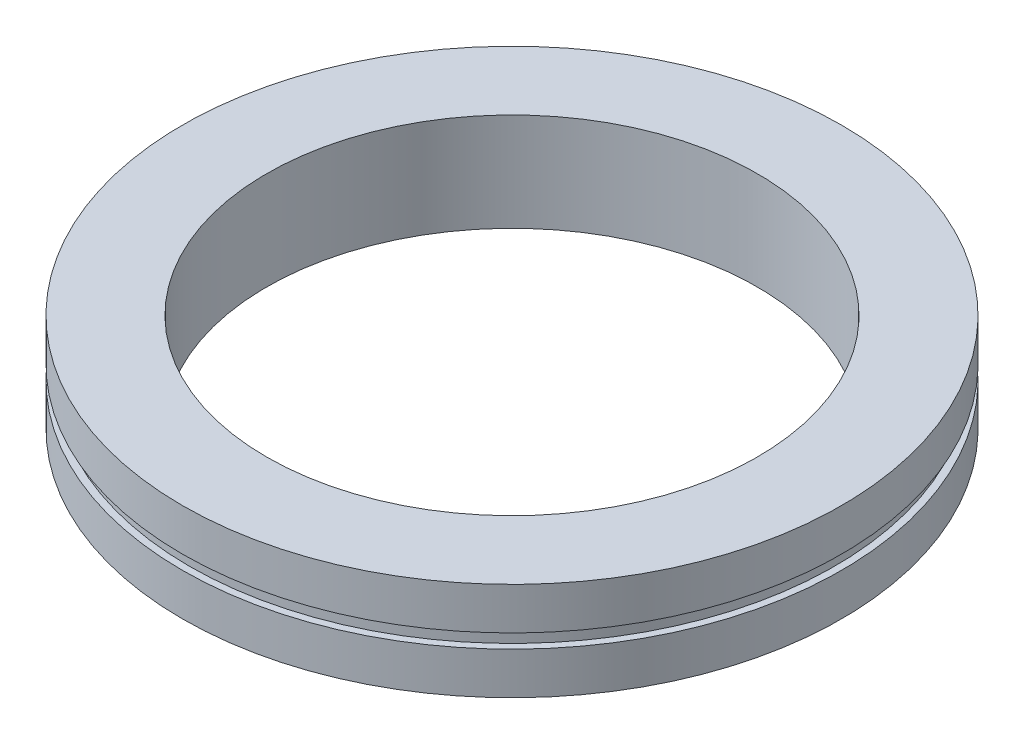
ISO-10303-21;
HEADER;
FILE_DESCRIPTION(('STEP AP214'),'2;1');
FILE_NAME('part.step','',(''),(''),'','','');
FILE_SCHEMA(('AUTOMOTIVE_DESIGN { 1 0 10303 214 1 1 1 1 }'));
ENDSEC;
DATA;
#1=APPLICATION_CONTEXT('core data for automotive mechanical design processes');
#2=APPLICATION_PROTOCOL_DEFINITION('international standard','automotive_design',2000,#1);
#3=PRODUCT_CONTEXT('',#1,'mechanical');
#4=PRODUCT('Part','Part','',(#3));
#5=PRODUCT_RELATED_PRODUCT_CATEGORY('part','',(#4));
#6=PRODUCT_DEFINITION_FORMATION('','',#4);
#7=PRODUCT_DEFINITION_CONTEXT('part definition',#1,'design');
#8=PRODUCT_DEFINITION('design','',#6,#7);
#9=PRODUCT_DEFINITION_SHAPE('','',#8);
#10=(LENGTH_UNIT() NAMED_UNIT(*) SI_UNIT(.MILLI.,.METRE.));
#11=(NAMED_UNIT(*) PLANE_ANGLE_UNIT() SI_UNIT($,.RADIAN.));
#12=(NAMED_UNIT(*) SI_UNIT($,.STERADIAN.) SOLID_ANGLE_UNIT());
#13=UNCERTAINTY_MEASURE_WITH_UNIT(LENGTH_MEASURE(1.E-05),#10,'distance_accuracy_value','');
#14=(GEOMETRIC_REPRESENTATION_CONTEXT(3) GLOBAL_UNCERTAINTY_ASSIGNED_CONTEXT((#13)) GLOBAL_UNIT_ASSIGNED_CONTEXT((#10,
#11,#12)) REPRESENTATION_CONTEXT('',''));
#15=CARTESIAN_POINT('',(0.,0.,0.));
#16=DIRECTION('',(0.,0.,1.));
#17=DIRECTION('',(1.,0.,0.));
#18=AXIS2_PLACEMENT_3D('',#15,#16,#17);
#19=CARTESIAN_POINT('',(0.,7.,0.));
#20=DIRECTION('',(0.,-1.,0.));
#21=DIRECTION('',(0.,0.,-1.));
#22=AXIS2_PLACEMENT_3D('',#19,#20,#21);
#23=CYLINDRICAL_SURFACE('',#22,23.5);
#24=CARTESIAN_POINT('',(0.,0.,0.));
#25=DIRECTION('',(0.,1.,0.));
#26=DIRECTION('',(0.,0.,1.));
#27=AXIS2_PLACEMENT_3D('',#24,#25,#26);
#28=CIRCLE('',#27,23.5);
#29=CARTESIAN_POINT('',(0.,0.,23.5));
#30=VERTEX_POINT('',#29);
#31=EDGE_CURVE('E37',#30,#30,#28,.T.);
#32=ORIENTED_EDGE('',*,*,#31,.T.);
#33=EDGE_LOOP('',(#32));
#34=FACE_BOUND('',#33,.T.);
#35=CARTESIAN_POINT('',(0.,3.,0.));
#36=DIRECTION('',(0.,1.,0.));
#37=DIRECTION('',(0.,0.,1.));
#38=AXIS2_PLACEMENT_3D('',#35,#36,#37);
#39=CIRCLE('',#38,23.5);
#40=CARTESIAN_POINT('',(0.,3.,23.5));
#41=VERTEX_POINT('',#40);
#42=EDGE_CURVE('E49',#41,#41,#39,.T.);
#43=ORIENTED_EDGE('',*,*,#42,.F.);
#44=EDGE_LOOP('',(#43));
#45=FACE_BOUND('',#44,.T.);
#46=ADVANCED_FACE('F34',(#34,#45),#23,.T.);
#47=CARTESIAN_POINT('',(0.,7.,0.));
#48=DIRECTION('',(0.,1.,0.));
#49=DIRECTION('',(0.,0.,1.));
#50=AXIS2_PLACEMENT_3D('',#47,#48,#49);
#51=CIRCLE('',#50,23.5);
#52=CARTESIAN_POINT('',(0.,7.,23.5));
#53=VERTEX_POINT('',#52);
#54=EDGE_CURVE('E10',#53,#53,#51,.T.);
#55=ORIENTED_EDGE('',*,*,#54,.F.);
#56=EDGE_LOOP('',(#55));
#57=FACE_BOUND('',#56,.T.);
#58=CARTESIAN_POINT('',(0.,4.,0.));
#59=DIRECTION('',(0.,1.,0.));
#60=DIRECTION('',(0.,0.,1.));
#61=AXIS2_PLACEMENT_3D('',#58,#59,#60);
#62=CIRCLE('',#61,23.5);
#63=CARTESIAN_POINT('',(0.,4.,23.5));
#64=VERTEX_POINT('',#63);
#65=EDGE_CURVE('E60',#64,#64,#62,.T.);
#66=ORIENTED_EDGE('',*,*,#65,.T.);
#67=EDGE_LOOP('',(#66));
#68=FACE_BOUND('',#67,.T.);
#69=ADVANCED_FACE('F64',(#57,#68),#23,.T.);
#70=CARTESIAN_POINT('',(0.,7.,0.));
#71=DIRECTION('',(0.,1.,0.));
#72=DIRECTION('',(0.,0.,1.));
#73=AXIS2_PLACEMENT_3D('',#70,#71,#72);
#74=PLANE('',#73);
#75=ORIENTED_EDGE('',*,*,#54,.T.);
#76=EDGE_LOOP('',(#75));
#77=FACE_BOUND('',#76,.T.);
#78=CARTESIAN_POINT('',(0.,7.,0.));
#79=DIRECTION('',(0.,1.,0.));
#80=DIRECTION('',(0.,0.,1.));
#81=AXIS2_PLACEMENT_3D('',#78,#79,#80);
#82=CIRCLE('',#81,17.5);
#83=CARTESIAN_POINT('',(0.,7.,17.5));
#84=VERTEX_POINT('',#83);
#85=EDGE_CURVE('E44',#84,#84,#82,.T.);
#86=ORIENTED_EDGE('',*,*,#85,.F.);
#87=EDGE_LOOP('',(#86));
#88=FACE_BOUND('',#87,.T.);
#89=ADVANCED_FACE('F82',(#77,#88),#74,.T.);
#90=CARTESIAN_POINT('',(0.,0.,0.));
#91=DIRECTION('',(0.,1.,0.));
#92=DIRECTION('',(0.,0.,1.));
#93=AXIS2_PLACEMENT_3D('',#90,#91,#92);
#94=PLANE('',#93);
#95=ORIENTED_EDGE('',*,*,#31,.F.);
#96=EDGE_LOOP('',(#95));
#97=FACE_BOUND('',#96,.T.);
#98=CARTESIAN_POINT('',(0.,0.,0.));
#99=DIRECTION('',(0.,1.,0.));
#100=DIRECTION('',(0.,0.,1.));
#101=AXIS2_PLACEMENT_3D('',#98,#99,#100);
#102=CIRCLE('',#101,17.5);
#103=CARTESIAN_POINT('',(0.,0.,17.5));
#104=VERTEX_POINT('',#103);
#105=EDGE_CURVE('E46',#104,#104,#102,.T.);
#106=ORIENTED_EDGE('',*,*,#105,.T.);
#107=EDGE_LOOP('',(#106));
#108=FACE_BOUND('',#107,.T.);
#109=ADVANCED_FACE('F98',(#97,#108),#94,.F.);
#110=CARTESIAN_POINT('',(0.,7.,0.));
#111=DIRECTION('',(0.,-1.,0.));
#112=DIRECTION('',(0.,0.,-1.));
#113=AXIS2_PLACEMENT_3D('',#110,#111,#112);
#114=CYLINDRICAL_SURFACE('',#113,17.5);
#115=ORIENTED_EDGE('',*,*,#85,.T.);
#116=EDGE_LOOP('',(#115));
#117=FACE_BOUND('',#116,.T.);
#118=ORIENTED_EDGE('',*,*,#105,.F.);
#119=EDGE_LOOP('',(#118));
#120=FACE_BOUND('',#119,.T.);
#121=ADVANCED_FACE('F90',(#117,#120),#114,.F.);
#122=CARTESIAN_POINT('',(23.5,3.,0.));
#123=DIRECTION('',(0.,1.,0.));
#124=DIRECTION('',(0.,0.,1.));
#125=AXIS2_PLACEMENT_3D('',#122,#123,#124);
#126=PLANE('',#125);
#127=ORIENTED_EDGE('',*,*,#42,.T.);
#128=EDGE_LOOP('',(#127));
#129=FACE_BOUND('',#128,.T.);
#130=CARTESIAN_POINT('',(0.,3.,0.));
#131=DIRECTION('',(0.,1.,0.));
#132=DIRECTION('',(0.,0.,1.));
#133=AXIS2_PLACEMENT_3D('',#130,#131,#132);
#134=CIRCLE('',#133,23.);
#135=CARTESIAN_POINT('',(0.,3.,23.));
#136=VERTEX_POINT('',#135);
#137=EDGE_CURVE('E54',#136,#136,#134,.T.);
#138=ORIENTED_EDGE('',*,*,#137,.F.);
#139=EDGE_LOOP('',(#138));
#140=FACE_BOUND('',#139,.T.);
#141=ADVANCED_FACE('F74',(#129,#140),#126,.T.);
#142=CARTESIAN_POINT('',(0.,7.,0.));
#143=DIRECTION('',(0.,1.,0.));
#144=DIRECTION('',(0.,0.,1.));
#145=AXIS2_PLACEMENT_3D('',#142,#143,#144);
#146=CYLINDRICAL_SURFACE('',#145,23.);
#147=ORIENTED_EDGE('',*,*,#137,.T.);
#148=EDGE_LOOP('',(#147));
#149=FACE_BOUND('',#148,.T.);
#150=CARTESIAN_POINT('',(0.,4.,0.));
#151=DIRECTION('',(0.,1.,0.));
#152=DIRECTION('',(0.,0.,1.));
#153=AXIS2_PLACEMENT_3D('',#150,#151,#152);
#154=CIRCLE('',#153,23.);
#155=CARTESIAN_POINT('',(0.,4.,23.));
#156=VERTEX_POINT('',#155);
#157=EDGE_CURVE('E57',#156,#156,#154,.T.);
#158=ORIENTED_EDGE('',*,*,#157,.F.);
#159=EDGE_LOOP('',(#158));
#160=FACE_BOUND('',#159,.T.);
#161=ADVANCED_FACE('F68',(#149,#160),#146,.T.);
#162=CARTESIAN_POINT('',(23.5,4.,0.));
#163=DIRECTION('',(0.,-1.,0.));
#164=DIRECTION('',(0.,0.,-1.));
#165=AXIS2_PLACEMENT_3D('',#162,#163,#164);
#166=PLANE('',#165);
#167=ORIENTED_EDGE('',*,*,#157,.T.);
#168=EDGE_LOOP('',(#167));
#169=FACE_BOUND('',#168,.T.);
#170=ORIENTED_EDGE('',*,*,#65,.F.);
#171=EDGE_LOOP('',(#170));
#172=FACE_BOUND('',#171,.T.);
#173=ADVANCED_FACE('F66',(#169,#172),#166,.T.);
#174=CLOSED_SHELL('',(#46,#69,#89,#109,#121,#141,#161,#173));
#175=MANIFOLD_SOLID_BREP('B2',#174);
#176=ADVANCED_BREP_SHAPE_REPRESENTATION('',(#18,#175),#14);
#177=SHAPE_DEFINITION_REPRESENTATION(#9,#176);
ENDSEC;
END-ISO-10303-21;
